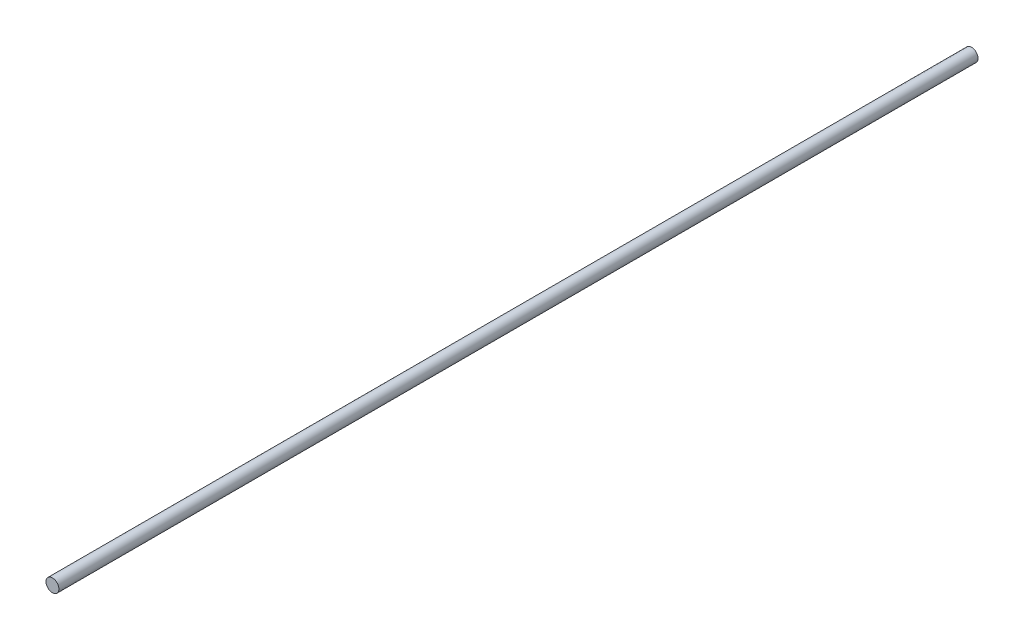
ISO-10303-21;
HEADER;
FILE_DESCRIPTION(('STEP AP214'),'2;1');
FILE_NAME('part.step','',(''),(''),'','','');
FILE_SCHEMA(('AUTOMOTIVE_DESIGN { 1 0 10303 214 1 1 1 1 }'));
ENDSEC;
DATA;
#1=APPLICATION_CONTEXT('core data for automotive mechanical design processes');
#2=APPLICATION_PROTOCOL_DEFINITION('international standard','automotive_design',2000,#1);
#3=PRODUCT_CONTEXT('',#1,'mechanical');
#4=PRODUCT('Part','Part','',(#3));
#5=PRODUCT_RELATED_PRODUCT_CATEGORY('part','',(#4));
#6=PRODUCT_DEFINITION_FORMATION('','',#4);
#7=PRODUCT_DEFINITION_CONTEXT('part definition',#1,'design');
#8=PRODUCT_DEFINITION('design','',#6,#7);
#9=PRODUCT_DEFINITION_SHAPE('','',#8);
#10=(LENGTH_UNIT() NAMED_UNIT(*) SI_UNIT(.MILLI.,.METRE.));
#11=(NAMED_UNIT(*) PLANE_ANGLE_UNIT() SI_UNIT($,.RADIAN.));
#12=(NAMED_UNIT(*) SI_UNIT($,.STERADIAN.) SOLID_ANGLE_UNIT());
#13=UNCERTAINTY_MEASURE_WITH_UNIT(LENGTH_MEASURE(1.E-05),#10,'distance_accuracy_value','');
#14=(GEOMETRIC_REPRESENTATION_CONTEXT(3) GLOBAL_UNCERTAINTY_ASSIGNED_CONTEXT((#13)) GLOBAL_UNIT_ASSIGNED_CONTEXT((#10,
#11,#12)) REPRESENTATION_CONTEXT('',''));
#15=CARTESIAN_POINT('',(0.,0.,0.));
#16=DIRECTION('',(0.,0.,1.));
#17=DIRECTION('',(1.,0.,0.));
#18=AXIS2_PLACEMENT_3D('',#15,#16,#17);
#19=CARTESIAN_POINT('',(0.,0.,285.));
#20=DIRECTION('',(0.,0.,-1.));
#21=DIRECTION('',(-1.,0.,0.));
#22=AXIS2_PLACEMENT_3D('',#19,#20,#21);
#23=CYLINDRICAL_SURFACE('',#22,4.);
#24=CARTESIAN_POINT('',(0.,0.,285.));
#25=DIRECTION('',(0.,0.,1.));
#26=DIRECTION('',(1.,0.,0.));
#27=AXIS2_PLACEMENT_3D('',#24,#25,#26);
#28=CIRCLE('',#27,4.);
#29=CARTESIAN_POINT('',(4.,0.,285.));
#30=VERTEX_POINT('',#29);
#31=EDGE_CURVE('E10',#30,#30,#28,.T.);
#32=ORIENTED_EDGE('',*,*,#31,.F.);
#33=EDGE_LOOP('',(#32));
#34=FACE_BOUND('',#33,.T.);
#35=CARTESIAN_POINT('',(0.,0.,-285.));
#36=DIRECTION('',(0.,0.,1.));
#37=DIRECTION('',(1.,0.,0.));
#38=AXIS2_PLACEMENT_3D('',#35,#36,#37);
#39=CIRCLE('',#38,4.);
#40=CARTESIAN_POINT('',(4.,0.,-285.));
#41=VERTEX_POINT('',#40);
#42=EDGE_CURVE('E40',#41,#41,#39,.T.);
#43=ORIENTED_EDGE('',*,*,#42,.T.);
#44=EDGE_LOOP('',(#43));
#45=FACE_BOUND('',#44,.T.);
#46=ADVANCED_FACE('F37',(#34,#45),#23,.T.);
#47=CARTESIAN_POINT('',(0.,0.,285.));
#48=DIRECTION('',(0.,0.,1.));
#49=DIRECTION('',(1.,0.,0.));
#50=AXIS2_PLACEMENT_3D('',#47,#48,#49);
#51=PLANE('',#50);
#52=ORIENTED_EDGE('',*,*,#31,.T.);
#53=EDGE_LOOP('',(#52));
#54=FACE_BOUND('',#53,.T.);
#55=ADVANCED_FACE('F54',(#54),#51,.T.);
#56=CARTESIAN_POINT('',(0.,0.,-285.));
#57=DIRECTION('',(0.,0.,1.));
#58=DIRECTION('',(1.,0.,0.));
#59=AXIS2_PLACEMENT_3D('',#56,#57,#58);
#60=PLANE('',#59);
#61=ORIENTED_EDGE('',*,*,#42,.F.);
#62=EDGE_LOOP('',(#61));
#63=FACE_BOUND('',#62,.T.);
#64=ADVANCED_FACE('F52',(#63),#60,.F.);
#65=CLOSED_SHELL('',(#46,#55,#64));
#66=MANIFOLD_SOLID_BREP('B2',#65);
#67=ADVANCED_BREP_SHAPE_REPRESENTATION('',(#18,#66),#14);
#68=SHAPE_DEFINITION_REPRESENTATION(#9,#67);
ENDSEC;
END-ISO-10303-21;
